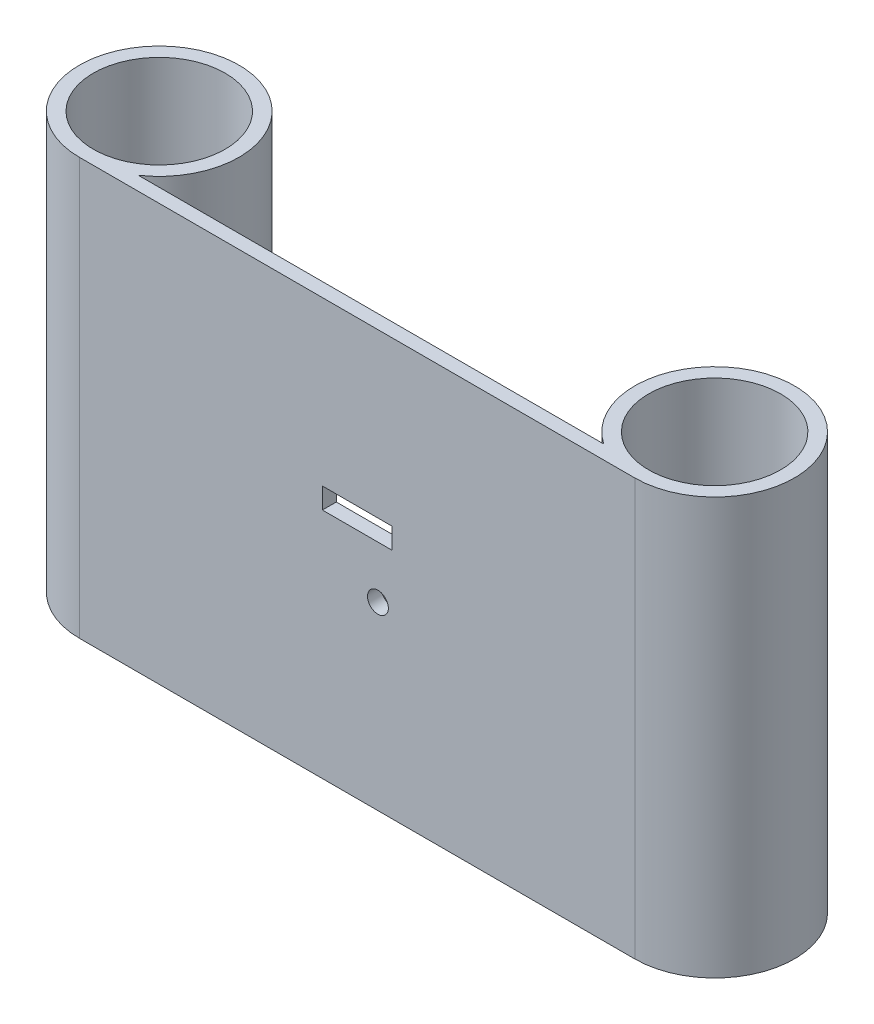
ISO-10303-21;
HEADER;
FILE_DESCRIPTION(('STEP AP214'),'2;1');
FILE_NAME('part.step','',(''),(''),'','','');
FILE_SCHEMA(('AUTOMOTIVE_DESIGN { 1 0 10303 214 1 1 1 1 }'));
ENDSEC;
DATA;
#1=APPLICATION_CONTEXT('core data for automotive mechanical design processes');
#2=APPLICATION_PROTOCOL_DEFINITION('international standard','automotive_design',2000,#1);
#3=PRODUCT_CONTEXT('',#1,'mechanical');
#4=PRODUCT('Part','Part','',(#3));
#5=PRODUCT_RELATED_PRODUCT_CATEGORY('part','',(#4));
#6=PRODUCT_DEFINITION_FORMATION('','',#4);
#7=PRODUCT_DEFINITION_CONTEXT('part definition',#1,'design');
#8=PRODUCT_DEFINITION('design','',#6,#7);
#9=PRODUCT_DEFINITION_SHAPE('','',#8);
#10=(LENGTH_UNIT() NAMED_UNIT(*) SI_UNIT(.MILLI.,.METRE.));
#11=(NAMED_UNIT(*) PLANE_ANGLE_UNIT() SI_UNIT($,.RADIAN.));
#12=(NAMED_UNIT(*) SI_UNIT($,.STERADIAN.) SOLID_ANGLE_UNIT());
#13=UNCERTAINTY_MEASURE_WITH_UNIT(LENGTH_MEASURE(1.E-05),#10,'distance_accuracy_value','');
#14=(GEOMETRIC_REPRESENTATION_CONTEXT(3) GLOBAL_UNCERTAINTY_ASSIGNED_CONTEXT((#13)) GLOBAL_UNIT_ASSIGNED_CONTEXT((#10,
#11,#12)) REPRESENTATION_CONTEXT('',''));
#15=CARTESIAN_POINT('',(0.,0.,0.));
#16=DIRECTION('',(0.,0.,1.));
#17=DIRECTION('',(1.,0.,0.));
#18=AXIS2_PLACEMENT_3D('',#15,#16,#17);
#19=CARTESIAN_POINT('',(40.,60.,0.));
#20=DIRECTION('',(0.,-1.,0.));
#21=DIRECTION('',(0.,0.,-1.));
#22=AXIS2_PLACEMENT_3D('',#19,#20,#21);
#23=PLANE('',#22);
#24=CARTESIAN_POINT('',(40.,60.,0.));
#25=DIRECTION('',(0.,-1.,0.));
#26=DIRECTION('',(0.,0.,-1.));
#27=AXIS2_PLACEMENT_3D('',#24,#25,#26);
#28=CIRCLE('',#27,9.5);
#29=CARTESIAN_POINT('',(40.,60.,-9.5));
#30=VERTEX_POINT('',#29);
#31=EDGE_CURVE('E218',#30,#30,#28,.T.);
#32=ORIENTED_EDGE('',*,*,#31,.T.);
#33=EDGE_LOOP('',(#32));
#34=FACE_BOUND('',#33,.T.);
#35=CARTESIAN_POINT('',(-40.,60.,0.));
#36=DIRECTION('',(0.,-1.,0.));
#37=DIRECTION('',(0.,0.,-1.));
#38=AXIS2_PLACEMENT_3D('',#35,#36,#37);
#39=CIRCLE('',#38,9.5);
#40=CARTESIAN_POINT('',(-40.,60.,-9.5));
#41=VERTEX_POINT('',#40);
#42=EDGE_CURVE('E221',#41,#41,#39,.T.);
#43=ORIENTED_EDGE('',*,*,#42,.T.);
#44=EDGE_LOOP('',(#43));
#45=FACE_BOUND('',#44,.T.);
#46=CARTESIAN_POINT('',(40.,60.,0.));
#47=DIRECTION('',(0.,1.,0.));
#48=DIRECTION('',(0.,0.,-1.));
#49=AXIS2_PLACEMENT_3D('',#46,#47,#48);
#50=CIRCLE('',#49,11.5);
#51=CARTESIAN_POINT('',(40.,60.,11.5));
#52=VERTEX_POINT('',#51);
#53=CARTESIAN_POINT('',(33.5192593015921,60.,9.5));
#54=VERTEX_POINT('',#53);
#55=EDGE_CURVE('E230',#52,#54,#50,.T.);
#56=ORIENTED_EDGE('',*,*,#55,.T.);
#57=DIRECTION('',(1.,0.,0.));
#58=VECTOR('',#57,1.);
#59=CARTESIAN_POINT('',(0.,60.,9.5));
#60=LINE('',#59,#58);
#61=CARTESIAN_POINT('',(-33.5192593015921,60.,9.5));
#62=VERTEX_POINT('',#61);
#63=EDGE_CURVE('E205',#62,#54,#60,.T.);
#64=ORIENTED_EDGE('',*,*,#63,.F.);
#65=CARTESIAN_POINT('',(-40.,60.,0.));
#66=DIRECTION('',(0.,1.,0.));
#67=DIRECTION('',(0.,0.,1.));
#68=AXIS2_PLACEMENT_3D('',#65,#66,#67);
#69=CIRCLE('',#68,11.5);
#70=CARTESIAN_POINT('',(-40.,60.,11.5));
#71=VERTEX_POINT('',#70);
#72=EDGE_CURVE('E232',#62,#71,#69,.T.);
#73=ORIENTED_EDGE('',*,*,#72,.T.);
#74=DIRECTION('',(1.,0.,0.));
#75=VECTOR('',#74,1.);
#76=CARTESIAN_POINT('',(-40.,60.,11.5));
#77=LINE('',#76,#75);
#78=EDGE_CURVE('E235',#71,#52,#77,.T.);
#79=ORIENTED_EDGE('',*,*,#78,.T.);
#80=EDGE_LOOP('',(#56,#64,#73,#79));
#81=FACE_BOUND('',#80,.T.);
#82=ADVANCED_FACE('F37',(#34,#45,#81),#23,.F.);
#83=CARTESIAN_POINT('',(40.,0.,0.));
#84=DIRECTION('',(0.,-1.,0.));
#85=DIRECTION('',(0.,0.,-1.));
#86=AXIS2_PLACEMENT_3D('',#83,#84,#85);
#87=PLANE('',#86);
#88=CARTESIAN_POINT('',(-40.,0.,0.));
#89=DIRECTION('',(0.,-1.,0.));
#90=DIRECTION('',(0.,0.,-1.));
#91=AXIS2_PLACEMENT_3D('',#88,#89,#90);
#92=CIRCLE('',#91,10.5);
#93=CARTESIAN_POINT('',(-40.,0.,-10.5));
#94=VERTEX_POINT('',#93);
#95=EDGE_CURVE('E11',#94,#94,#92,.F.);
#96=ORIENTED_EDGE('',*,*,#95,.T.);
#97=EDGE_LOOP('',(#96));
#98=FACE_BOUND('',#97,.T.);
#99=CARTESIAN_POINT('',(-6.02079728939615,0.,6.));
#100=DIRECTION('',(0.,-1.,0.));
#101=DIRECTION('',(0.,0.,-1.));
#102=AXIS2_PLACEMENT_3D('',#99,#100,#101);
#103=CIRCLE('',#102,1.5);
#104=CARTESIAN_POINT('',(-6.02079728939615,0.,4.5));
#105=VERTEX_POINT('',#104);
#106=EDGE_CURVE('E165',#105,#105,#103,.T.);
#107=ORIENTED_EDGE('',*,*,#106,.F.);
#108=EDGE_LOOP('',(#107));
#109=FACE_BOUND('',#108,.T.);
#110=CARTESIAN_POINT('',(5.97920271060385,0.,6.0414513939539));
#111=DIRECTION('',(0.,-1.,0.));
#112=DIRECTION('',(0.,0.,-1.));
#113=AXIS2_PLACEMENT_3D('',#110,#111,#112);
#114=CIRCLE('',#113,1.5);
#115=CARTESIAN_POINT('',(5.97920271060385,0.,4.5414513939539));
#116=VERTEX_POINT('',#115);
#117=EDGE_CURVE('E159',#116,#116,#114,.T.);
#118=ORIENTED_EDGE('',*,*,#117,.F.);
#119=EDGE_LOOP('',(#118));
#120=FACE_BOUND('',#119,.T.);
#121=CARTESIAN_POINT('',(5.97920271060385,0.,-6.0414513939539));
#122=DIRECTION('',(0.,-1.,0.));
#123=DIRECTION('',(0.,0.,-1.));
#124=AXIS2_PLACEMENT_3D('',#121,#122,#123);
#125=CIRCLE('',#124,1.5);
#126=CARTESIAN_POINT('',(5.97920271060385,0.,-7.5414513939539));
#127=VERTEX_POINT('',#126);
#128=EDGE_CURVE('E152',#127,#127,#125,.T.);
#129=ORIENTED_EDGE('',*,*,#128,.F.);
#130=EDGE_LOOP('',(#129));
#131=FACE_BOUND('',#130,.T.);
#132=CARTESIAN_POINT('',(-6.02079728939615,0.,-6.));
#133=DIRECTION('',(0.,-1.,0.));
#134=DIRECTION('',(0.,0.,-1.));
#135=AXIS2_PLACEMENT_3D('',#132,#133,#134);
#136=CIRCLE('',#135,1.5);
#137=CARTESIAN_POINT('',(-6.02079728939615,0.,-7.5));
#138=VERTEX_POINT('',#137);
#139=EDGE_CURVE('E155',#138,#138,#136,.T.);
#140=ORIENTED_EDGE('',*,*,#139,.F.);
#141=EDGE_LOOP('',(#140));
#142=FACE_BOUND('',#141,.T.);
#143=CARTESIAN_POINT('',(0.,0.,0.));
#144=DIRECTION('',(0.,-1.,0.));
#145=DIRECTION('',(0.,0.,-1.));
#146=AXIS2_PLACEMENT_3D('',#143,#144,#145);
#147=CIRCLE('',#146,4.1);
#148=CARTESIAN_POINT('',(0.,0.,-4.1));
#149=VERTEX_POINT('',#148);
#150=EDGE_CURVE('E174',#149,#149,#147,.T.);
#151=ORIENTED_EDGE('',*,*,#150,.F.);
#152=EDGE_LOOP('',(#151));
#153=FACE_BOUND('',#152,.T.);
#154=CARTESIAN_POINT('',(40.,0.,0.));
#155=DIRECTION('',(0.,-1.,0.));
#156=DIRECTION('',(0.,0.,-1.));
#157=AXIS2_PLACEMENT_3D('',#154,#155,#156);
#158=CIRCLE('',#157,9.5);
#159=CARTESIAN_POINT('',(40.,0.,-9.5));
#160=VERTEX_POINT('',#159);
#161=EDGE_CURVE('E225',#160,#160,#158,.T.);
#162=ORIENTED_EDGE('',*,*,#161,.F.);
#163=EDGE_LOOP('',(#162));
#164=FACE_BOUND('',#163,.T.);
#165=CARTESIAN_POINT('',(-40.,0.,0.));
#166=DIRECTION('',(0.,1.,0.));
#167=DIRECTION('',(0.,0.,1.));
#168=AXIS2_PLACEMENT_3D('',#165,#166,#167);
#169=CIRCLE('',#168,11.5);
#170=CARTESIAN_POINT('',(-33.5192593015921,0.,9.5));
#171=VERTEX_POINT('',#170);
#172=CARTESIAN_POINT('',(-40.,0.,11.5));
#173=VERTEX_POINT('',#172);
#174=EDGE_CURVE('E240',#171,#173,#169,.T.);
#175=ORIENTED_EDGE('',*,*,#174,.F.);
#176=CARTESIAN_POINT('',(-33.5192593015921,0.,-12.9674824445754));
#177=DIRECTION('',(0.,1.,0.));
#178=DIRECTION('',(0.,0.,1.));
#179=AXIS2_PLACEMENT_3D('',#176,#177,#178);
#180=CIRCLE('',#179,22.4674824445754);
#181=CARTESIAN_POINT('',(-12.8195267658437,0.,-4.23198930762071));
#182=VERTEX_POINT('',#181);
#183=EDGE_CURVE('E180',#171,#182,#180,.T.);
#184=ORIENTED_EDGE('',*,*,#183,.T.);
#185=CARTESIAN_POINT('',(0.,0.,0.));
#186=DIRECTION('',(0.,-1.,0.));
#187=DIRECTION('',(0.,0.,1.));
#188=AXIS2_PLACEMENT_3D('',#185,#186,#187);
#189=CIRCLE('',#188,13.5);
#190=CARTESIAN_POINT('',(12.8195267658437,0.,-4.23198930762071));
#191=VERTEX_POINT('',#190);
#192=EDGE_CURVE('E198',#182,#191,#189,.T.);
#193=ORIENTED_EDGE('',*,*,#192,.T.);
#194=CARTESIAN_POINT('',(33.5192593015921,0.,-12.9674824445754));
#195=DIRECTION('',(0.,1.,0.));
#196=DIRECTION('',(0.,0.,-1.));
#197=AXIS2_PLACEMENT_3D('',#194,#195,#196);
#198=CIRCLE('',#197,22.4674824445754);
#199=CARTESIAN_POINT('',(33.5192593015921,0.,9.5));
#200=VERTEX_POINT('',#199);
#201=EDGE_CURVE('E187',#191,#200,#198,.T.);
#202=ORIENTED_EDGE('',*,*,#201,.T.);
#203=CARTESIAN_POINT('',(40.,0.,0.));
#204=DIRECTION('',(0.,1.,0.));
#205=DIRECTION('',(0.,0.,-1.));
#206=AXIS2_PLACEMENT_3D('',#203,#204,#205);
#207=CIRCLE('',#206,11.5);
#208=CARTESIAN_POINT('',(40.,0.,11.5));
#209=VERTEX_POINT('',#208);
#210=EDGE_CURVE('E224',#209,#200,#207,.T.);
#211=ORIENTED_EDGE('',*,*,#210,.F.);
#212=DIRECTION('',(1.,0.,0.));
#213=VECTOR('',#212,1.);
#214=CARTESIAN_POINT('',(-40.,0.,11.5));
#215=LINE('',#214,#213);
#216=EDGE_CURVE('E233',#173,#209,#215,.T.);
#217=ORIENTED_EDGE('',*,*,#216,.F.);
#218=EDGE_LOOP('',(#175,#184,#193,#202,#211,#217));
#219=FACE_BOUND('',#218,.T.);
#220=ADVANCED_FACE('F270',(#98,#109,#120,#131,#142,#153,#164,#219),#87,.T.);
#221=CARTESIAN_POINT('',(40.,60.,0.));
#222=DIRECTION('',(0.,-1.,0.));
#223=DIRECTION('',(0.,0.,-1.));
#224=AXIS2_PLACEMENT_3D('',#221,#222,#223);
#225=CYLINDRICAL_SURFACE('',#224,11.5);
#226=ORIENTED_EDGE('',*,*,#210,.T.);
#227=DIRECTION('',(0.,-1.,0.));
#228=VECTOR('',#227,1.);
#229=CARTESIAN_POINT('',(33.5192593015921,3.,9.5));
#230=LINE('',#229,#228);
#231=CARTESIAN_POINT('',(33.5192593015921,3.,9.5));
#232=VERTEX_POINT('',#231);
#233=EDGE_CURVE('E206',#232,#200,#230,.T.);
#234=ORIENTED_EDGE('',*,*,#233,.F.);
#235=DIRECTION('',(0.,-1.,0.));
#236=VECTOR('',#235,1.);
#237=CARTESIAN_POINT('',(33.5192593015921,60.,9.5));
#238=LINE('',#237,#236);
#239=EDGE_CURVE('E214',#54,#232,#238,.T.);
#240=ORIENTED_EDGE('',*,*,#239,.F.);
#241=ORIENTED_EDGE('',*,*,#55,.F.);
#242=DIRECTION('',(0.,-1.,0.));
#243=VECTOR('',#242,1.);
#244=CARTESIAN_POINT('',(40.,60.,11.5));
#245=LINE('',#244,#243);
#246=EDGE_CURVE('E237',#52,#209,#245,.T.);
#247=ORIENTED_EDGE('',*,*,#246,.T.);
#248=EDGE_LOOP('',(#226,#234,#240,#241,#247));
#249=FACE_BOUND('',#248,.T.);
#250=ADVANCED_FACE('F276',(#249),#225,.T.);
#251=CARTESIAN_POINT('',(-40.,60.,0.));
#252=DIRECTION('',(0.,-1.,0.));
#253=DIRECTION('',(0.,0.,-1.));
#254=AXIS2_PLACEMENT_3D('',#251,#252,#253);
#255=CYLINDRICAL_SURFACE('',#254,11.5);
#256=ORIENTED_EDGE('',*,*,#174,.T.);
#257=DIRECTION('',(0.,-1.,0.));
#258=VECTOR('',#257,1.);
#259=CARTESIAN_POINT('',(-40.,60.,11.5));
#260=LINE('',#259,#258);
#261=EDGE_CURVE('E245',#71,#173,#260,.T.);
#262=ORIENTED_EDGE('',*,*,#261,.F.);
#263=ORIENTED_EDGE('',*,*,#72,.F.);
#264=DIRECTION('',(0.,-1.,0.));
#265=VECTOR('',#264,1.);
#266=CARTESIAN_POINT('',(-33.5192593015921,60.,9.5));
#267=LINE('',#266,#265);
#268=CARTESIAN_POINT('',(-33.5192593015921,3.,9.5));
#269=VERTEX_POINT('',#268);
#270=EDGE_CURVE('E215',#62,#269,#267,.T.);
#271=ORIENTED_EDGE('',*,*,#270,.T.);
#272=DIRECTION('',(0.,-1.,0.));
#273=VECTOR('',#272,1.);
#274=CARTESIAN_POINT('',(-33.5192593015921,3.,9.5));
#275=LINE('',#274,#273);
#276=EDGE_CURVE('E202',#269,#171,#275,.T.);
#277=ORIENTED_EDGE('',*,*,#276,.T.);
#278=EDGE_LOOP('',(#256,#262,#263,#271,#277));
#279=FACE_BOUND('',#278,.T.);
#280=ADVANCED_FACE('F286',(#279),#255,.T.);
#281=CARTESIAN_POINT('',(-40.,60.,11.5));
#282=DIRECTION('',(0.,0.,-1.));
#283=DIRECTION('',(-1.,0.,0.));
#284=AXIS2_PLACEMENT_3D('',#281,#282,#283);
#285=PLANE('',#284);
#286=DIRECTION('',(1.,0.,0.));
#287=VECTOR('',#286,1.);
#288=CARTESIAN_POINT('',(5.00000000000001,33.5,11.5));
#289=LINE('',#288,#287);
#290=CARTESIAN_POINT('',(-4.99999999999999,33.5,11.5));
#291=VERTEX_POINT('',#290);
#292=CARTESIAN_POINT('',(5.00000000000001,33.5,11.5));
#293=VERTEX_POINT('',#292);
#294=EDGE_CURVE('E132',#291,#293,#289,.T.);
#295=ORIENTED_EDGE('',*,*,#294,.F.);
#296=DIRECTION('',(0.,-1.,0.));
#297=VECTOR('',#296,1.);
#298=CARTESIAN_POINT('',(-4.99999999999999,33.5,11.5));
#299=LINE('',#298,#297);
#300=CARTESIAN_POINT('',(-4.99999999999999,36.5,11.5));
#301=VERTEX_POINT('',#300);
#302=EDGE_CURVE('E52',#301,#291,#299,.T.);
#303=ORIENTED_EDGE('',*,*,#302,.F.);
#304=DIRECTION('',(-1.,0.,0.));
#305=VECTOR('',#304,1.);
#306=CARTESIAN_POINT('',(5.00000000000001,36.5,11.5));
#307=LINE('',#306,#305);
#308=CARTESIAN_POINT('',(5.00000000000001,36.5,11.5));
#309=VERTEX_POINT('',#308);
#310=EDGE_CURVE('E139',#309,#301,#307,.T.);
#311=ORIENTED_EDGE('',*,*,#310,.F.);
#312=DIRECTION('',(0.,1.,0.));
#313=VECTOR('',#312,1.);
#314=CARTESIAN_POINT('',(5.00000000000001,33.5,11.5));
#315=LINE('',#314,#313);
#316=EDGE_CURVE('E123',#293,#309,#315,.T.);
#317=ORIENTED_EDGE('',*,*,#316,.F.);
#318=EDGE_LOOP('',(#295,#303,#311,#317));
#319=FACE_BOUND('',#318,.T.);
#320=CARTESIAN_POINT('',(3.00000000000001,26.,11.5));
#321=DIRECTION('',(0.,0.,1.));
#322=DIRECTION('',(1.,0.,0.));
#323=AXIS2_PLACEMENT_3D('',#320,#321,#322);
#324=CIRCLE('',#323,1.5);
#325=CARTESIAN_POINT('',(4.50000000000001,26.,11.5));
#326=VERTEX_POINT('',#325);
#327=EDGE_CURVE('E149',#326,#326,#324,.T.);
#328=ORIENTED_EDGE('',*,*,#327,.F.);
#329=EDGE_LOOP('',(#328));
#330=FACE_BOUND('',#329,.T.);
#331=ORIENTED_EDGE('',*,*,#216,.T.);
#332=ORIENTED_EDGE('',*,*,#246,.F.);
#333=ORIENTED_EDGE('',*,*,#78,.F.);
#334=ORIENTED_EDGE('',*,*,#261,.T.);
#335=EDGE_LOOP('',(#331,#332,#333,#334));
#336=FACE_BOUND('',#335,.T.);
#337=ADVANCED_FACE('F136',(#319,#330,#336),#285,.F.);
#338=CARTESIAN_POINT('',(40.,60.,0.));
#339=DIRECTION('',(0.,-1.,0.));
#340=DIRECTION('',(0.,0.,-1.));
#341=AXIS2_PLACEMENT_3D('',#338,#339,#340);
#342=CYLINDRICAL_SURFACE('',#341,9.5);
#343=ORIENTED_EDGE('',*,*,#31,.F.);
#344=EDGE_LOOP('',(#343));
#345=FACE_BOUND('',#344,.T.);
#346=ORIENTED_EDGE('',*,*,#161,.T.);
#347=EDGE_LOOP('',(#346));
#348=FACE_BOUND('',#347,.T.);
#349=ADVANCED_FACE('F281',(#345,#348),#342,.F.);
#350=CARTESIAN_POINT('',(-40.,60.,0.));
#351=DIRECTION('',(0.,-1.,0.));
#352=DIRECTION('',(0.,0.,-1.));
#353=AXIS2_PLACEMENT_3D('',#350,#351,#352);
#354=CYLINDRICAL_SURFACE('',#353,9.5);
#355=CARTESIAN_POINT('',(-40.,1.,0.));
#356=DIRECTION('',(0.,-1.,0.));
#357=DIRECTION('',(0.,0.,-1.));
#358=AXIS2_PLACEMENT_3D('',#355,#356,#357);
#359=CIRCLE('',#358,9.5);
#360=CARTESIAN_POINT('',(-40.,1.,-9.5));
#361=VERTEX_POINT('',#360);
#362=EDGE_CURVE('E45',#361,#361,#359,.T.);
#363=ORIENTED_EDGE('',*,*,#362,.T.);
#364=EDGE_LOOP('',(#363));
#365=FACE_BOUND('',#364,.T.);
#366=ORIENTED_EDGE('',*,*,#42,.F.);
#367=EDGE_LOOP('',(#366));
#368=FACE_BOUND('',#367,.T.);
#369=ADVANCED_FACE('F259',(#365,#368),#354,.F.);
#370=CARTESIAN_POINT('',(0.,60.,9.5));
#371=DIRECTION('',(0.,0.,-1.));
#372=DIRECTION('',(-1.,0.,0.));
#373=AXIS2_PLACEMENT_3D('',#370,#371,#372);
#374=PLANE('',#373);
#375=DIRECTION('',(0.,1.,0.));
#376=VECTOR('',#375,1.);
#377=CARTESIAN_POINT('',(-4.99999999999999,60.,9.5));
#378=LINE('',#377,#376);
#379=CARTESIAN_POINT('',(-4.99999999999999,33.5,9.5));
#380=VERTEX_POINT('',#379);
#381=CARTESIAN_POINT('',(-4.99999999999999,36.5,9.5));
#382=VERTEX_POINT('',#381);
#383=EDGE_CURVE('E255',#380,#382,#378,.T.);
#384=ORIENTED_EDGE('',*,*,#383,.F.);
#385=DIRECTION('',(-1.,0.,0.));
#386=VECTOR('',#385,1.);
#387=CARTESIAN_POINT('',(0.,33.5,9.5));
#388=LINE('',#387,#386);
#389=CARTESIAN_POINT('',(5.00000000000001,33.5,9.5));
#390=VERTEX_POINT('',#389);
#391=EDGE_CURVE('E248',#390,#380,#388,.T.);
#392=ORIENTED_EDGE('',*,*,#391,.F.);
#393=DIRECTION('',(0.,-1.,0.));
#394=VECTOR('',#393,1.);
#395=CARTESIAN_POINT('',(4.99999999999999,60.,9.5));
#396=LINE('',#395,#394);
#397=CARTESIAN_POINT('',(5.00000000000001,36.5,9.5));
#398=VERTEX_POINT('',#397);
#399=EDGE_CURVE('E126',#398,#390,#396,.T.);
#400=ORIENTED_EDGE('',*,*,#399,.F.);
#401=DIRECTION('',(1.,0.,0.));
#402=VECTOR('',#401,1.);
#403=CARTESIAN_POINT('',(0.,36.5,9.5));
#404=LINE('',#403,#402);
#405=EDGE_CURVE('E253',#382,#398,#404,.T.);
#406=ORIENTED_EDGE('',*,*,#405,.F.);
#407=EDGE_LOOP('',(#384,#392,#400,#406));
#408=FACE_BOUND('',#407,.T.);
#409=CARTESIAN_POINT('',(3.00000000000001,26.,9.5));
#410=DIRECTION('',(0.,0.,-1.));
#411=DIRECTION('',(-1.,0.,0.));
#412=AXIS2_PLACEMENT_3D('',#409,#410,#411);
#413=CIRCLE('',#412,1.5);
#414=CARTESIAN_POINT('',(1.50000000000001,26.,9.5));
#415=VERTEX_POINT('',#414);
#416=EDGE_CURVE('E146',#415,#415,#413,.T.);
#417=ORIENTED_EDGE('',*,*,#416,.F.);
#418=EDGE_LOOP('',(#417));
#419=FACE_BOUND('',#418,.T.);
#420=DIRECTION('',(-1.,0.,0.));
#421=VECTOR('',#420,1.);
#422=CARTESIAN_POINT('',(-33.5192593015921,3.,9.5));
#423=LINE('',#422,#421);
#424=EDGE_CURVE('E192',#232,#269,#423,.T.);
#425=ORIENTED_EDGE('',*,*,#424,.T.);
#426=ORIENTED_EDGE('',*,*,#270,.F.);
#427=ORIENTED_EDGE('',*,*,#63,.T.);
#428=ORIENTED_EDGE('',*,*,#239,.T.);
#429=EDGE_LOOP('',(#425,#426,#427,#428));
#430=FACE_BOUND('',#429,.T.);
#431=ADVANCED_FACE('F313',(#408,#419,#430),#374,.T.);
#432=CARTESIAN_POINT('',(-33.5192593015921,3.,-12.9674824445754));
#433=DIRECTION('',(0.,-1.,0.));
#434=DIRECTION('',(0.,0.,-1.));
#435=AXIS2_PLACEMENT_3D('',#432,#433,#434);
#436=CYLINDRICAL_SURFACE('',#435,22.4674824445754);
#437=ORIENTED_EDGE('',*,*,#183,.F.);
#438=ORIENTED_EDGE('',*,*,#276,.F.);
#439=CARTESIAN_POINT('',(-33.5192593015921,3.,-12.9674824445754));
#440=DIRECTION('',(0.,1.,0.));
#441=DIRECTION('',(0.,0.,1.));
#442=AXIS2_PLACEMENT_3D('',#439,#440,#441);
#443=CIRCLE('',#442,22.4674824445754);
#444=CARTESIAN_POINT('',(-12.8195267658437,3.,-4.23198930762071));
#445=VERTEX_POINT('',#444);
#446=EDGE_CURVE('E183',#269,#445,#443,.T.);
#447=ORIENTED_EDGE('',*,*,#446,.T.);
#448=DIRECTION('',(0.,-1.,0.));
#449=VECTOR('',#448,1.);
#450=CARTESIAN_POINT('',(-12.8195267658437,3.,-4.23198930762071));
#451=LINE('',#450,#449);
#452=EDGE_CURVE('E195',#445,#182,#451,.T.);
#453=ORIENTED_EDGE('',*,*,#452,.T.);
#454=EDGE_LOOP('',(#437,#438,#447,#453));
#455=FACE_BOUND('',#454,.T.);
#456=ADVANCED_FACE('F320',(#455),#436,.F.);
#457=CARTESIAN_POINT('',(33.5192593015921,3.,-12.9674824445754));
#458=DIRECTION('',(0.,-1.,0.));
#459=DIRECTION('',(0.,0.,-1.));
#460=AXIS2_PLACEMENT_3D('',#457,#458,#459);
#461=CYLINDRICAL_SURFACE('',#460,22.4674824445754);
#462=ORIENTED_EDGE('',*,*,#201,.F.);
#463=DIRECTION('',(0.,-1.,0.));
#464=VECTOR('',#463,1.);
#465=CARTESIAN_POINT('',(12.8195267658437,3.,-4.23198930762071));
#466=LINE('',#465,#464);
#467=CARTESIAN_POINT('',(12.8195267658437,3.,-4.23198930762071));
#468=VERTEX_POINT('',#467);
#469=EDGE_CURVE('E209',#468,#191,#466,.T.);
#470=ORIENTED_EDGE('',*,*,#469,.F.);
#471=CARTESIAN_POINT('',(33.5192593015921,3.,-12.9674824445754));
#472=DIRECTION('',(0.,1.,0.));
#473=DIRECTION('',(0.,0.,-1.));
#474=AXIS2_PLACEMENT_3D('',#471,#472,#473);
#475=CIRCLE('',#474,22.4674824445754);
#476=EDGE_CURVE('E190',#468,#232,#475,.T.);
#477=ORIENTED_EDGE('',*,*,#476,.T.);
#478=ORIENTED_EDGE('',*,*,#233,.T.);
#479=EDGE_LOOP('',(#462,#470,#477,#478));
#480=FACE_BOUND('',#479,.T.);
#481=ADVANCED_FACE('F304',(#480),#461,.F.);
#482=CARTESIAN_POINT('',(0.,3.,0.));
#483=DIRECTION('',(0.,-1.,0.));
#484=DIRECTION('',(0.,0.,-1.));
#485=AXIS2_PLACEMENT_3D('',#482,#483,#484);
#486=CYLINDRICAL_SURFACE('',#485,13.5);
#487=ORIENTED_EDGE('',*,*,#192,.F.);
#488=ORIENTED_EDGE('',*,*,#452,.F.);
#489=CARTESIAN_POINT('',(0.,3.,0.));
#490=DIRECTION('',(0.,-1.,0.));
#491=DIRECTION('',(0.,0.,1.));
#492=AXIS2_PLACEMENT_3D('',#489,#490,#491);
#493=CIRCLE('',#492,13.5);
#494=EDGE_CURVE('E186',#445,#468,#493,.T.);
#495=ORIENTED_EDGE('',*,*,#494,.T.);
#496=ORIENTED_EDGE('',*,*,#469,.T.);
#497=EDGE_LOOP('',(#487,#488,#495,#496));
#498=FACE_BOUND('',#497,.T.);
#499=ADVANCED_FACE('F322',(#498),#486,.T.);
#500=CARTESIAN_POINT('',(-33.5192593015921,3.,-12.9674824445754));
#501=DIRECTION('',(0.,1.,0.));
#502=DIRECTION('',(0.,0.,1.));
#503=AXIS2_PLACEMENT_3D('',#500,#501,#502);
#504=PLANE('',#503);
#505=CARTESIAN_POINT('',(-6.02079728939615,3.,6.));
#506=DIRECTION('',(0.,-1.,0.));
#507=DIRECTION('',(0.,0.,-1.));
#508=AXIS2_PLACEMENT_3D('',#505,#506,#507);
#509=CIRCLE('',#508,1.5);
#510=CARTESIAN_POINT('',(-6.02079728939615,3.,4.5));
#511=VERTEX_POINT('',#510);
#512=EDGE_CURVE('E168',#511,#511,#509,.T.);
#513=ORIENTED_EDGE('',*,*,#512,.T.);
#514=EDGE_LOOP('',(#513));
#515=FACE_BOUND('',#514,.T.);
#516=CARTESIAN_POINT('',(5.97920271060385,3.,6.0414513939539));
#517=DIRECTION('',(0.,-1.,0.));
#518=DIRECTION('',(0.,0.,-1.));
#519=AXIS2_PLACEMENT_3D('',#516,#517,#518);
#520=CIRCLE('',#519,1.5);
#521=CARTESIAN_POINT('',(5.97920271060385,3.,4.5414513939539));
#522=VERTEX_POINT('',#521);
#523=EDGE_CURVE('E162',#522,#522,#520,.T.);
#524=ORIENTED_EDGE('',*,*,#523,.T.);
#525=EDGE_LOOP('',(#524));
#526=FACE_BOUND('',#525,.T.);
#527=CARTESIAN_POINT('',(5.97920271060385,3.,-6.0414513939539));
#528=DIRECTION('',(0.,-1.,0.));
#529=DIRECTION('',(0.,0.,-1.));
#530=AXIS2_PLACEMENT_3D('',#527,#528,#529);
#531=CIRCLE('',#530,1.5);
#532=CARTESIAN_POINT('',(5.97920271060385,3.,-7.5414513939539));
#533=VERTEX_POINT('',#532);
#534=EDGE_CURVE('E156',#533,#533,#531,.T.);
#535=ORIENTED_EDGE('',*,*,#534,.T.);
#536=EDGE_LOOP('',(#535));
#537=FACE_BOUND('',#536,.T.);
#538=CARTESIAN_POINT('',(-6.02079728939615,3.,-6.));
#539=DIRECTION('',(0.,-1.,0.));
#540=DIRECTION('',(0.,0.,-1.));
#541=AXIS2_PLACEMENT_3D('',#538,#539,#540);
#542=CIRCLE('',#541,1.5);
#543=CARTESIAN_POINT('',(-6.02079728939615,3.,-7.5));
#544=VERTEX_POINT('',#543);
#545=EDGE_CURVE('E171',#544,#544,#542,.T.);
#546=ORIENTED_EDGE('',*,*,#545,.T.);
#547=EDGE_LOOP('',(#546));
#548=FACE_BOUND('',#547,.T.);
#549=CARTESIAN_POINT('',(0.,3.,0.));
#550=DIRECTION('',(0.,-1.,0.));
#551=DIRECTION('',(0.,0.,-1.));
#552=AXIS2_PLACEMENT_3D('',#549,#550,#551);
#553=CIRCLE('',#552,4.1);
#554=CARTESIAN_POINT('',(0.,3.,-4.1));
#555=VERTEX_POINT('',#554);
#556=EDGE_CURVE('E177',#555,#555,#553,.T.);
#557=ORIENTED_EDGE('',*,*,#556,.T.);
#558=EDGE_LOOP('',(#557));
#559=FACE_BOUND('',#558,.T.);
#560=ORIENTED_EDGE('',*,*,#446,.F.);
#561=ORIENTED_EDGE('',*,*,#424,.F.);
#562=ORIENTED_EDGE('',*,*,#476,.F.);
#563=ORIENTED_EDGE('',*,*,#494,.F.);
#564=EDGE_LOOP('',(#560,#561,#562,#563));
#565=FACE_BOUND('',#564,.T.);
#566=ADVANCED_FACE('F310',(#515,#526,#537,#548,#559,#565),#504,.T.);
#567=CARTESIAN_POINT('',(0.,3.,0.));
#568=DIRECTION('',(0.,-1.,0.));
#569=DIRECTION('',(0.,0.,-1.));
#570=AXIS2_PLACEMENT_3D('',#567,#568,#569);
#571=CYLINDRICAL_SURFACE('',#570,4.1);
#572=ORIENTED_EDGE('',*,*,#556,.F.);
#573=EDGE_LOOP('',(#572));
#574=FACE_BOUND('',#573,.T.);
#575=ORIENTED_EDGE('',*,*,#150,.T.);
#576=EDGE_LOOP('',(#575));
#577=FACE_BOUND('',#576,.T.);
#578=ADVANCED_FACE('F329',(#574,#577),#571,.F.);
#579=CARTESIAN_POINT('',(-6.02079728939615,3.,-6.));
#580=DIRECTION('',(0.,-1.,0.));
#581=DIRECTION('',(0.,0.,-1.));
#582=AXIS2_PLACEMENT_3D('',#579,#580,#581);
#583=CYLINDRICAL_SURFACE('',#582,1.5);
#584=ORIENTED_EDGE('',*,*,#545,.F.);
#585=EDGE_LOOP('',(#584));
#586=FACE_BOUND('',#585,.T.);
#587=ORIENTED_EDGE('',*,*,#139,.T.);
#588=EDGE_LOOP('',(#587));
#589=FACE_BOUND('',#588,.T.);
#590=ADVANCED_FACE('F393',(#586,#589),#583,.F.);
#591=CARTESIAN_POINT('',(5.97920271060385,3.,-6.0414513939539));
#592=DIRECTION('',(0.,-1.,0.));
#593=DIRECTION('',(0.,0.,-1.));
#594=AXIS2_PLACEMENT_3D('',#591,#592,#593);
#595=CYLINDRICAL_SURFACE('',#594,1.5);
#596=ORIENTED_EDGE('',*,*,#534,.F.);
#597=EDGE_LOOP('',(#596));
#598=FACE_BOUND('',#597,.T.);
#599=ORIENTED_EDGE('',*,*,#128,.T.);
#600=EDGE_LOOP('',(#599));
#601=FACE_BOUND('',#600,.T.);
#602=ADVANCED_FACE('F410',(#598,#601),#595,.F.);
#603=CARTESIAN_POINT('',(5.97920271060385,3.,6.0414513939539));
#604=DIRECTION('',(0.,-1.,0.));
#605=DIRECTION('',(0.,0.,-1.));
#606=AXIS2_PLACEMENT_3D('',#603,#604,#605);
#607=CYLINDRICAL_SURFACE('',#606,1.5);
#608=ORIENTED_EDGE('',*,*,#523,.F.);
#609=EDGE_LOOP('',(#608));
#610=FACE_BOUND('',#609,.T.);
#611=ORIENTED_EDGE('',*,*,#117,.T.);
#612=EDGE_LOOP('',(#611));
#613=FACE_BOUND('',#612,.T.);
#614=ADVANCED_FACE('F421',(#610,#613),#607,.F.);
#615=CARTESIAN_POINT('',(-6.02079728939615,3.,6.));
#616=DIRECTION('',(0.,-1.,0.));
#617=DIRECTION('',(0.,0.,-1.));
#618=AXIS2_PLACEMENT_3D('',#615,#616,#617);
#619=CYLINDRICAL_SURFACE('',#618,1.5);
#620=ORIENTED_EDGE('',*,*,#512,.F.);
#621=EDGE_LOOP('',(#620));
#622=FACE_BOUND('',#621,.T.);
#623=ORIENTED_EDGE('',*,*,#106,.T.);
#624=EDGE_LOOP('',(#623));
#625=FACE_BOUND('',#624,.T.);
#626=ADVANCED_FACE('F431',(#622,#625),#619,.F.);
#627=CARTESIAN_POINT('',(3.00000000000001,26.,8.5));
#628=DIRECTION('',(0.,0.,1.));
#629=DIRECTION('',(1.,0.,0.));
#630=AXIS2_PLACEMENT_3D('',#627,#628,#629);
#631=CYLINDRICAL_SURFACE('',#630,1.5);
#632=ORIENTED_EDGE('',*,*,#416,.T.);
#633=EDGE_LOOP('',(#632));
#634=FACE_BOUND('',#633,.T.);
#635=ORIENTED_EDGE('',*,*,#327,.T.);
#636=EDGE_LOOP('',(#635));
#637=FACE_BOUND('',#636,.T.);
#638=ADVANCED_FACE('F441',(#634,#637),#631,.F.);
#639=CARTESIAN_POINT('',(-4.99999999999999,33.5,8.5));
#640=DIRECTION('',(-1.,0.,0.));
#641=DIRECTION('',(0.,0.,1.));
#642=AXIS2_PLACEMENT_3D('',#639,#640,#641);
#643=PLANE('',#642);
#644=ORIENTED_EDGE('',*,*,#383,.T.);
#645=DIRECTION('',(0.,0.,1.));
#646=VECTOR('',#645,1.);
#647=CARTESIAN_POINT('',(-4.99999999999999,36.5,8.5));
#648=LINE('',#647,#646);
#649=EDGE_CURVE('E144',#382,#301,#648,.T.);
#650=ORIENTED_EDGE('',*,*,#649,.T.);
#651=ORIENTED_EDGE('',*,*,#302,.T.);
#652=DIRECTION('',(0.,0.,1.));
#653=VECTOR('',#652,1.);
#654=CARTESIAN_POINT('',(-4.99999999999999,33.5,8.5));
#655=LINE('',#654,#653);
#656=EDGE_CURVE('E129',#380,#291,#655,.T.);
#657=ORIENTED_EDGE('',*,*,#656,.F.);
#658=EDGE_LOOP('',(#644,#650,#651,#657));
#659=FACE_BOUND('',#658,.T.);
#660=ADVANCED_FACE('F453',(#659),#643,.F.);
#661=CARTESIAN_POINT('',(5.00000000000001,36.5,8.5));
#662=DIRECTION('',(0.,1.,0.));
#663=DIRECTION('',(-1.,0.,0.));
#664=AXIS2_PLACEMENT_3D('',#661,#662,#663);
#665=PLANE('',#664);
#666=ORIENTED_EDGE('',*,*,#405,.T.);
#667=DIRECTION('',(0.,0.,1.));
#668=VECTOR('',#667,1.);
#669=CARTESIAN_POINT('',(5.00000000000001,36.5,8.5));
#670=LINE('',#669,#668);
#671=EDGE_CURVE('E128',#398,#309,#670,.T.);
#672=ORIENTED_EDGE('',*,*,#671,.T.);
#673=ORIENTED_EDGE('',*,*,#310,.T.);
#674=ORIENTED_EDGE('',*,*,#649,.F.);
#675=EDGE_LOOP('',(#666,#672,#673,#674));
#676=FACE_BOUND('',#675,.T.);
#677=ADVANCED_FACE('F460',(#676),#665,.F.);
#678=CARTESIAN_POINT('',(5.00000000000001,33.5,8.5));
#679=DIRECTION('',(1.,0.,0.));
#680=DIRECTION('',(0.,1.,0.));
#681=AXIS2_PLACEMENT_3D('',#678,#679,#680);
#682=PLANE('',#681);
#683=ORIENTED_EDGE('',*,*,#399,.T.);
#684=DIRECTION('',(0.,0.,1.));
#685=VECTOR('',#684,1.);
#686=CARTESIAN_POINT('',(5.00000000000001,33.5,8.5));
#687=LINE('',#686,#685);
#688=EDGE_CURVE('E60',#390,#293,#687,.T.);
#689=ORIENTED_EDGE('',*,*,#688,.T.);
#690=ORIENTED_EDGE('',*,*,#316,.T.);
#691=ORIENTED_EDGE('',*,*,#671,.F.);
#692=EDGE_LOOP('',(#683,#689,#690,#691));
#693=FACE_BOUND('',#692,.T.);
#694=ADVANCED_FACE('F120',(#693),#682,.F.);
#695=CARTESIAN_POINT('',(5.00000000000001,33.5,8.5));
#696=DIRECTION('',(0.,-1.,0.));
#697=DIRECTION('',(1.,0.,0.));
#698=AXIS2_PLACEMENT_3D('',#695,#696,#697);
#699=PLANE('',#698);
#700=ORIENTED_EDGE('',*,*,#391,.T.);
#701=ORIENTED_EDGE('',*,*,#656,.T.);
#702=ORIENTED_EDGE('',*,*,#294,.T.);
#703=ORIENTED_EDGE('',*,*,#688,.F.);
#704=EDGE_LOOP('',(#700,#701,#702,#703));
#705=FACE_BOUND('',#704,.T.);
#706=ADVANCED_FACE('F133',(#705),#699,.F.);
#707=CARTESIAN_POINT('',(-40.,1.,0.));
#708=DIRECTION('',(0.,-1.,0.));
#709=DIRECTION('',(0.,0.,-1.));
#710=AXIS2_PLACEMENT_3D('',#707,#708,#709);
#711=TOROIDAL_SURFACE('',#710,10.5,1.);
#712=ORIENTED_EDGE('',*,*,#95,.F.);
#713=EDGE_LOOP('',(#712));
#714=FACE_BOUND('',#713,.T.);
#715=ORIENTED_EDGE('',*,*,#362,.F.);
#716=EDGE_LOOP('',(#715));
#717=FACE_BOUND('',#716,.T.);
#718=ADVANCED_FACE('F39',(#714,#717),#711,.T.);
#719=CLOSED_SHELL('',(#82,#220,#250,#280,#337,#349,#369,#431,#456,#481,#499,#566,#578,#590,#602,
#614,#626,#638,#660,#677,#694,#706,#718));
#720=MANIFOLD_SOLID_BREP('B2',#719);
#721=ADVANCED_BREP_SHAPE_REPRESENTATION('',(#18,#720),#14);
#722=SHAPE_DEFINITION_REPRESENTATION(#9,#721);
ENDSEC;
END-ISO-10303-21;
